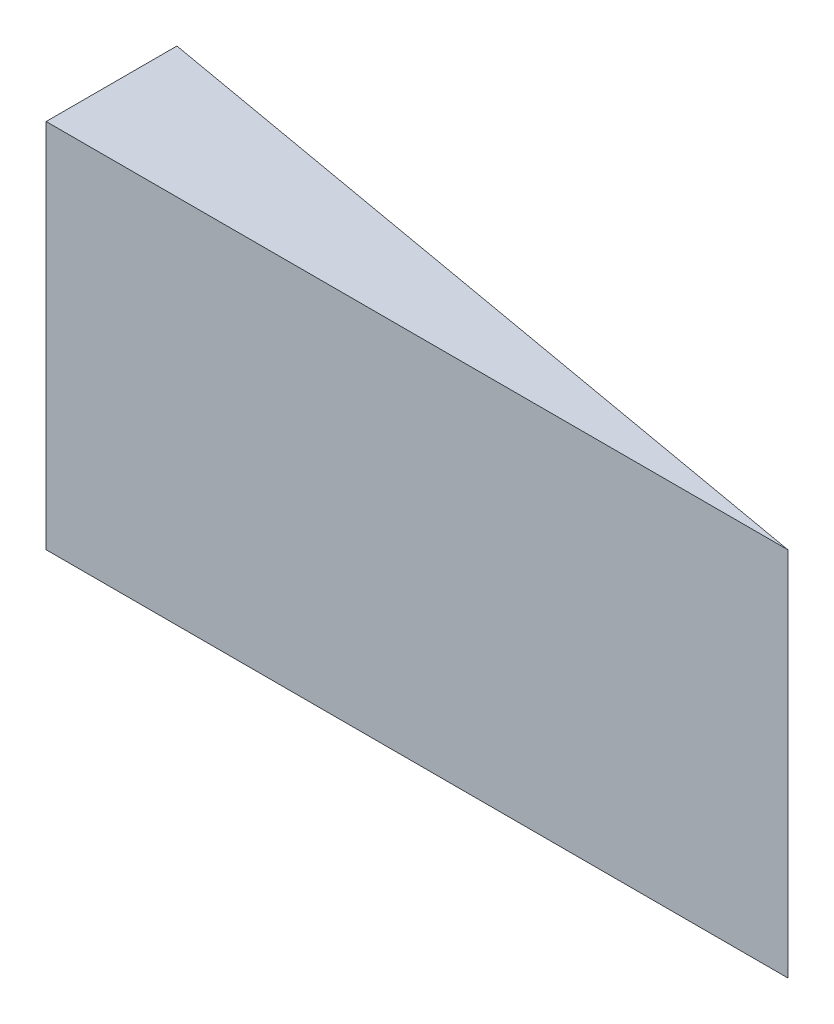
ISO-10303-21;
HEADER;
FILE_DESCRIPTION(('STEP AP214'),'2;1');
FILE_NAME('part.step','',(''),(''),'','','');
FILE_SCHEMA(('AUTOMOTIVE_DESIGN { 1 0 10303 214 1 1 1 1 }'));
ENDSEC;
DATA;
#1=APPLICATION_CONTEXT('core data for automotive mechanical design processes');
#2=APPLICATION_PROTOCOL_DEFINITION('international standard','automotive_design',2000,#1);
#3=PRODUCT_CONTEXT('',#1,'mechanical');
#4=PRODUCT('Part','Part','',(#3));
#5=PRODUCT_RELATED_PRODUCT_CATEGORY('part','',(#4));
#6=PRODUCT_DEFINITION_FORMATION('','',#4);
#7=PRODUCT_DEFINITION_CONTEXT('part definition',#1,'design');
#8=PRODUCT_DEFINITION('design','',#6,#7);
#9=PRODUCT_DEFINITION_SHAPE('','',#8);
#10=(LENGTH_UNIT() NAMED_UNIT(*) SI_UNIT(.MILLI.,.METRE.));
#11=(NAMED_UNIT(*) PLANE_ANGLE_UNIT() SI_UNIT($,.RADIAN.));
#12=(NAMED_UNIT(*) SI_UNIT($,.STERADIAN.) SOLID_ANGLE_UNIT());
#13=UNCERTAINTY_MEASURE_WITH_UNIT(LENGTH_MEASURE(1.E-05),#10,'distance_accuracy_value','');
#14=(GEOMETRIC_REPRESENTATION_CONTEXT(3) GLOBAL_UNCERTAINTY_ASSIGNED_CONTEXT((#13)) GLOBAL_UNIT_ASSIGNED_CONTEXT((#10,
#11,#12)) REPRESENTATION_CONTEXT('',''));
#15=CARTESIAN_POINT('',(0.,0.,0.));
#16=DIRECTION('',(0.,0.,1.));
#17=DIRECTION('',(1.,0.,0.));
#18=AXIS2_PLACEMENT_3D('',#15,#16,#17);
#19=CARTESIAN_POINT('',(0.,20.,-7.05307922833831));
#20=DIRECTION('',(1.,0.,0.));
#21=DIRECTION('',(0.,0.,-1.));
#22=AXIS2_PLACEMENT_3D('',#19,#20,#21);
#23=PLANE('',#22);
#24=DIRECTION('',(0.,0.,1.));
#25=VECTOR('',#24,1.);
#26=CARTESIAN_POINT('',(0.,0.,-7.05307922833831));
#27=LINE('',#26,#25);
#28=CARTESIAN_POINT('',(0.,0.,-7.05307922833831));
#29=VERTEX_POINT('',#28);
#30=CARTESIAN_POINT('',(0.,0.,0.));
#31=VERTEX_POINT('',#30);
#32=EDGE_CURVE('E89',#29,#31,#27,.T.);
#33=ORIENTED_EDGE('',*,*,#32,.T.);
#34=DIRECTION('',(0.,-1.,0.));
#35=VECTOR('',#34,1.);
#36=CARTESIAN_POINT('',(0.,20.,0.));
#37=LINE('',#36,#35);
#38=CARTESIAN_POINT('',(0.,20.,0.));
#39=VERTEX_POINT('',#38);
#40=EDGE_CURVE('E11',#39,#31,#37,.T.);
#41=ORIENTED_EDGE('',*,*,#40,.F.);
#42=DIRECTION('',(0.,0.,1.));
#43=VECTOR('',#42,1.);
#44=CARTESIAN_POINT('',(0.,20.,-7.05307922833831));
#45=LINE('',#44,#43);
#46=CARTESIAN_POINT('',(0.,20.,-7.05307922833831));
#47=VERTEX_POINT('',#46);
#48=EDGE_CURVE('E81',#47,#39,#45,.T.);
#49=ORIENTED_EDGE('',*,*,#48,.F.);
#50=DIRECTION('',(0.,-1.,0.));
#51=VECTOR('',#50,1.);
#52=CARTESIAN_POINT('',(0.,20.,-7.05307922833831));
#53=LINE('',#52,#51);
#54=EDGE_CURVE('E90',#47,#29,#53,.T.);
#55=ORIENTED_EDGE('',*,*,#54,.T.);
#56=EDGE_LOOP('',(#33,#41,#49,#55));
#57=FACE_BOUND('',#56,.T.);
#58=ADVANCED_FACE('F39',(#57),#23,.F.);
#59=CARTESIAN_POINT('',(0.,20.,0.));
#60=DIRECTION('',(0.,0.,-1.));
#61=DIRECTION('',(-1.,0.,0.));
#62=AXIS2_PLACEMENT_3D('',#59,#60,#61);
#63=PLANE('',#62);
#64=DIRECTION('',(1.,0.,0.));
#65=VECTOR('',#64,1.);
#66=CARTESIAN_POINT('',(0.,0.,0.));
#67=LINE('',#66,#65);
#68=CARTESIAN_POINT('',(40.,0.,0.));
#69=VERTEX_POINT('',#68);
#70=EDGE_CURVE('E68',#31,#69,#67,.T.);
#71=ORIENTED_EDGE('',*,*,#70,.T.);
#72=DIRECTION('',(0.,-1.,0.));
#73=VECTOR('',#72,1.);
#74=CARTESIAN_POINT('',(40.,20.,0.));
#75=LINE('',#74,#73);
#76=CARTESIAN_POINT('',(40.,20.,0.));
#77=VERTEX_POINT('',#76);
#78=EDGE_CURVE('E48',#77,#69,#75,.T.);
#79=ORIENTED_EDGE('',*,*,#78,.F.);
#80=DIRECTION('',(1.,0.,0.));
#81=VECTOR('',#80,1.);
#82=CARTESIAN_POINT('',(0.,20.,0.));
#83=LINE('',#82,#81);
#84=EDGE_CURVE('E76',#39,#77,#83,.T.);
#85=ORIENTED_EDGE('',*,*,#84,.F.);
#86=ORIENTED_EDGE('',*,*,#40,.T.);
#87=EDGE_LOOP('',(#71,#79,#85,#86));
#88=FACE_BOUND('',#87,.T.);
#89=ADVANCED_FACE('F77',(#88),#63,.F.);
#90=CARTESIAN_POINT('',(40.,20.,0.));
#91=DIRECTION('',(-0.173648177666923,0.,0.984807753012209));
#92=DIRECTION('',(0.984807753012209,0.,0.173648177666923));
#93=AXIS2_PLACEMENT_3D('',#90,#91,#92);
#94=PLANE('',#93);
#95=DIRECTION('',(-0.984807753012209,0.,-0.173648177666923));
#96=VECTOR('',#95,1.);
#97=CARTESIAN_POINT('',(40.,0.,0.));
#98=LINE('',#97,#96);
#99=EDGE_CURVE('E73',#69,#29,#98,.T.);
#100=ORIENTED_EDGE('',*,*,#99,.T.);
#101=ORIENTED_EDGE('',*,*,#54,.F.);
#102=DIRECTION('',(-0.984807753012209,0.,-0.173648177666923));
#103=VECTOR('',#102,1.);
#104=CARTESIAN_POINT('',(40.,20.,0.));
#105=LINE('',#104,#103);
#106=EDGE_CURVE('E56',#77,#47,#105,.T.);
#107=ORIENTED_EDGE('',*,*,#106,.F.);
#108=ORIENTED_EDGE('',*,*,#78,.T.);
#109=EDGE_LOOP('',(#100,#101,#107,#108));
#110=FACE_BOUND('',#109,.T.);
#111=ADVANCED_FACE('F102',(#110),#94,.F.);
#112=CARTESIAN_POINT('',(0.,20.,0.));
#113=DIRECTION('',(0.,1.,0.));
#114=DIRECTION('',(0.,0.,1.));
#115=AXIS2_PLACEMENT_3D('',#112,#113,#114);
#116=PLANE('',#115);
#117=ORIENTED_EDGE('',*,*,#48,.T.);
#118=ORIENTED_EDGE('',*,*,#84,.T.);
#119=ORIENTED_EDGE('',*,*,#106,.T.);
#120=EDGE_LOOP('',(#117,#118,#119));
#121=FACE_BOUND('',#120,.T.);
#122=ADVANCED_FACE('F84',(#121),#116,.T.);
#123=CARTESIAN_POINT('',(0.,0.,0.));
#124=DIRECTION('',(0.,1.,0.));
#125=DIRECTION('',(0.,0.,1.));
#126=AXIS2_PLACEMENT_3D('',#123,#124,#125);
#127=PLANE('',#126);
#128=ORIENTED_EDGE('',*,*,#32,.F.);
#129=ORIENTED_EDGE('',*,*,#99,.F.);
#130=ORIENTED_EDGE('',*,*,#70,.F.);
#131=EDGE_LOOP('',(#128,#129,#130));
#132=FACE_BOUND('',#131,.T.);
#133=ADVANCED_FACE('F103',(#132),#127,.F.);
#134=CLOSED_SHELL('',(#58,#89,#111,#122,#133));
#135=MANIFOLD_SOLID_BREP('B2',#134);
#136=ADVANCED_BREP_SHAPE_REPRESENTATION('',(#18,#135),#14);
#137=SHAPE_DEFINITION_REPRESENTATION(#9,#136);
ENDSEC;
END-ISO-10303-21;
